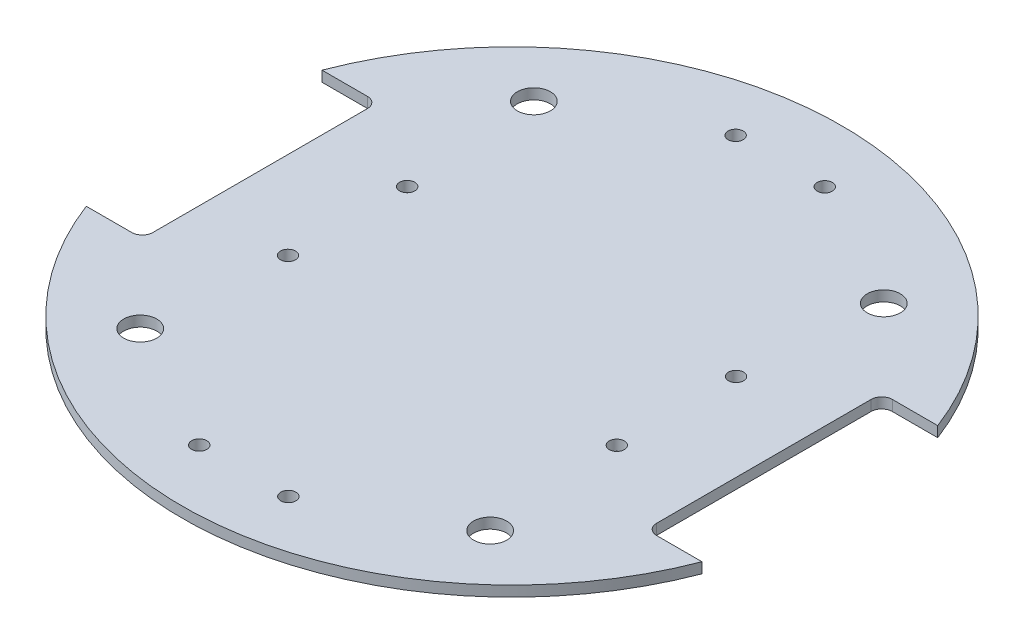
ISO-10303-21;
HEADER;
FILE_DESCRIPTION(('STEP AP214'),'2;1');
FILE_NAME('part.step','',(''),(''),'','','');
FILE_SCHEMA(('AUTOMOTIVE_DESIGN { 1 0 10303 214 1 1 1 1 }'));
ENDSEC;
DATA;
#1=APPLICATION_CONTEXT('core data for automotive mechanical design processes');
#2=APPLICATION_PROTOCOL_DEFINITION('international standard','automotive_design',2000,#1);
#3=PRODUCT_CONTEXT('',#1,'mechanical');
#4=PRODUCT('Part','Part','',(#3));
#5=PRODUCT_RELATED_PRODUCT_CATEGORY('part','',(#4));
#6=PRODUCT_DEFINITION_FORMATION('','',#4);
#7=PRODUCT_DEFINITION_CONTEXT('part definition',#1,'design');
#8=PRODUCT_DEFINITION('design','',#6,#7);
#9=PRODUCT_DEFINITION_SHAPE('','',#8);
#10=(LENGTH_UNIT() NAMED_UNIT(*) SI_UNIT(.MILLI.,.METRE.));
#11=(NAMED_UNIT(*) PLANE_ANGLE_UNIT() SI_UNIT($,.RADIAN.));
#12=(NAMED_UNIT(*) SI_UNIT($,.STERADIAN.) SOLID_ANGLE_UNIT());
#13=UNCERTAINTY_MEASURE_WITH_UNIT(LENGTH_MEASURE(1.E-05),#10,'distance_accuracy_value','');
#14=(GEOMETRIC_REPRESENTATION_CONTEXT(3) GLOBAL_UNCERTAINTY_ASSIGNED_CONTEXT((#13)) GLOBAL_UNIT_ASSIGNED_CONTEXT((#10,
#11,#12)) REPRESENTATION_CONTEXT('',''));
#15=CARTESIAN_POINT('',(0.,0.,0.));
#16=DIRECTION('',(0.,0.,1.));
#17=DIRECTION('',(1.,0.,0.));
#18=AXIS2_PLACEMENT_3D('',#15,#16,#17);
#19=CARTESIAN_POINT('',(0.,1.5875,0.));
#20=DIRECTION('',(0.,1.,0.));
#21=DIRECTION('',(0.,0.,1.));
#22=AXIS2_PLACEMENT_3D('',#19,#20,#21);
#23=PLANE('',#22);
#24=CARTESIAN_POINT('',(24.83,1.5875,9.));
#25=DIRECTION('',(0.,-1.,0.));
#26=DIRECTION('',(0.,0.,-1.));
#27=AXIS2_PLACEMENT_3D('',#24,#25,#26);
#28=CIRCLE('',#27,1.143);
#29=CARTESIAN_POINT('',(24.83,1.5875,7.857));
#30=VERTEX_POINT('',#29);
#31=EDGE_CURVE('E301',#30,#30,#28,.T.);
#32=ORIENTED_EDGE('',*,*,#31,.T.);
#33=EDGE_LOOP('',(#32));
#34=FACE_BOUND('',#33,.T.);
#35=CARTESIAN_POINT('',(24.83,1.5875,-9.));
#36=DIRECTION('',(0.,1.,0.));
#37=DIRECTION('',(0.,0.,1.));
#38=AXIS2_PLACEMENT_3D('',#35,#36,#37);
#39=CIRCLE('',#38,1.143);
#40=CARTESIAN_POINT('',(24.83,1.5875,-7.857));
#41=VERTEX_POINT('',#40);
#42=EDGE_CURVE('E306',#41,#41,#39,.T.);
#43=ORIENTED_EDGE('',*,*,#42,.F.);
#44=EDGE_LOOP('',(#43));
#45=FACE_BOUND('',#44,.T.);
#46=CARTESIAN_POINT('',(-26.42,1.5875,29.72));
#47=DIRECTION('',(0.,-1.,0.));
#48=DIRECTION('',(0.,0.,1.));
#49=AXIS2_PLACEMENT_3D('',#46,#47,#48);
#50=CIRCLE('',#49,2.5);
#51=CARTESIAN_POINT('',(-26.42,1.5875,32.22));
#52=VERTEX_POINT('',#51);
#53=EDGE_CURVE('E199',#52,#52,#50,.T.);
#54=ORIENTED_EDGE('',*,*,#53,.T.);
#55=EDGE_LOOP('',(#54));
#56=FACE_BOUND('',#55,.T.);
#57=CARTESIAN_POINT('',(-6.73,1.5875,-40.5));
#58=DIRECTION('',(0.,-1.,0.));
#59=DIRECTION('',(0.,0.,1.));
#60=AXIS2_PLACEMENT_3D('',#57,#58,#59);
#61=CIRCLE('',#60,1.145);
#62=CARTESIAN_POINT('',(-6.73,1.5875,-39.355));
#63=VERTEX_POINT('',#62);
#64=EDGE_CURVE('E220',#63,#63,#61,.T.);
#65=ORIENTED_EDGE('',*,*,#64,.T.);
#66=EDGE_LOOP('',(#65));
#67=FACE_BOUND('',#66,.T.);
#68=CARTESIAN_POINT('',(6.73,1.5875,-40.5));
#69=DIRECTION('',(0.,1.,0.));
#70=DIRECTION('',(0.,0.,1.));
#71=AXIS2_PLACEMENT_3D('',#68,#69,#70);
#72=CIRCLE('',#71,1.145);
#73=CARTESIAN_POINT('',(6.73,1.5875,-39.355));
#74=VERTEX_POINT('',#73);
#75=EDGE_CURVE('E226',#74,#74,#72,.T.);
#76=ORIENTED_EDGE('',*,*,#75,.F.);
#77=EDGE_LOOP('',(#76));
#78=FACE_BOUND('',#77,.T.);
#79=CARTESIAN_POINT('',(26.42,1.5875,29.72));
#80=DIRECTION('',(0.,1.,0.));
#81=DIRECTION('',(0.,0.,1.));
#82=AXIS2_PLACEMENT_3D('',#79,#80,#81);
#83=CIRCLE('',#82,2.5);
#84=CARTESIAN_POINT('',(26.42,1.5875,32.22));
#85=VERTEX_POINT('',#84);
#86=EDGE_CURVE('E162',#85,#85,#83,.T.);
#87=ORIENTED_EDGE('',*,*,#86,.F.);
#88=EDGE_LOOP('',(#87));
#89=FACE_BOUND('',#88,.T.);
#90=CARTESIAN_POINT('',(26.42,1.5875,-29.72));
#91=DIRECTION('',(0.,1.,0.));
#92=DIRECTION('',(0.,0.,1.));
#93=AXIS2_PLACEMENT_3D('',#90,#91,#92);
#94=CIRCLE('',#93,2.5);
#95=CARTESIAN_POINT('',(26.42,1.5875,-27.22));
#96=VERTEX_POINT('',#95);
#97=EDGE_CURVE('E166',#96,#96,#94,.T.);
#98=ORIENTED_EDGE('',*,*,#97,.F.);
#99=EDGE_LOOP('',(#98));
#100=FACE_BOUND('',#99,.T.);
#101=DIRECTION('',(1.,0.,0.));
#102=VECTOR('',#101,1.);
#103=CARTESIAN_POINT('',(-38.03,1.5875,-17.8));
#104=LINE('',#103,#102);
#105=CARTESIAN_POINT('',(-46.4887986508578,1.5875,-17.8));
#106=VERTEX_POINT('',#105);
#107=CARTESIAN_POINT('',(-39.63,1.5875,-17.8));
#108=VERTEX_POINT('',#107);
#109=EDGE_CURVE('E130',#106,#108,#104,.T.);
#110=ORIENTED_EDGE('',*,*,#109,.T.);
#111=CARTESIAN_POINT('',(-39.63,1.5875,-16.2));
#112=DIRECTION('',(0.,1.,0.));
#113=DIRECTION('',(0.,0.,1.));
#114=AXIS2_PLACEMENT_3D('',#111,#112,#113);
#115=CIRCLE('',#114,1.6);
#116=CARTESIAN_POINT('',(-38.03,1.5875,-16.2));
#117=VERTEX_POINT('',#116);
#118=EDGE_CURVE('E193',#108,#117,#115,.F.);
#119=ORIENTED_EDGE('',*,*,#118,.T.);
#120=DIRECTION('',(0.,0.,1.));
#121=VECTOR('',#120,1.);
#122=CARTESIAN_POINT('',(-38.03,1.5875,0.));
#123=LINE('',#122,#121);
#124=CARTESIAN_POINT('',(-38.03,1.5875,16.2));
#125=VERTEX_POINT('',#124);
#126=EDGE_CURVE('E232',#117,#125,#123,.T.);
#127=ORIENTED_EDGE('',*,*,#126,.T.);
#128=CARTESIAN_POINT('',(-39.63,1.5875,16.2));
#129=DIRECTION('',(0.,1.,0.));
#130=DIRECTION('',(0.,0.,1.));
#131=AXIS2_PLACEMENT_3D('',#128,#129,#130);
#132=CIRCLE('',#131,1.6);
#133=CARTESIAN_POINT('',(-39.63,1.5875,17.8));
#134=VERTEX_POINT('',#133);
#135=EDGE_CURVE('E43',#125,#134,#132,.F.);
#136=ORIENTED_EDGE('',*,*,#135,.T.);
#137=DIRECTION('',(-1.,0.,0.));
#138=VECTOR('',#137,1.);
#139=CARTESIAN_POINT('',(-38.03,1.5875,17.8));
#140=LINE('',#139,#138);
#141=CARTESIAN_POINT('',(-46.4887986508578,1.5875,17.8));
#142=VERTEX_POINT('',#141);
#143=EDGE_CURVE('E236',#134,#142,#140,.T.);
#144=ORIENTED_EDGE('',*,*,#143,.T.);
#145=CARTESIAN_POINT('',(0.,1.5875,0.));
#146=DIRECTION('',(0.,1.,0.));
#147=DIRECTION('',(0.,0.,1.));
#148=AXIS2_PLACEMENT_3D('',#145,#146,#147);
#149=CIRCLE('',#148,49.78);
#150=CARTESIAN_POINT('',(46.4887986508578,1.5875,17.8));
#151=VERTEX_POINT('',#150);
#152=EDGE_CURVE('E152',#142,#151,#149,.T.);
#153=ORIENTED_EDGE('',*,*,#152,.T.);
#154=DIRECTION('',(1.,0.,0.));
#155=VECTOR('',#154,1.);
#156=CARTESIAN_POINT('',(38.03,1.5875,17.8));
#157=LINE('',#156,#155);
#158=CARTESIAN_POINT('',(39.63,1.5875,17.8));
#159=VERTEX_POINT('',#158);
#160=EDGE_CURVE('E243',#159,#151,#157,.T.);
#161=ORIENTED_EDGE('',*,*,#160,.F.);
#162=CARTESIAN_POINT('',(39.63,1.5875,16.2));
#163=DIRECTION('',(0.,1.,0.));
#164=DIRECTION('',(0.,0.,1.));
#165=AXIS2_PLACEMENT_3D('',#162,#163,#164);
#166=CIRCLE('',#165,1.6);
#167=CARTESIAN_POINT('',(38.03,1.5875,16.2));
#168=VERTEX_POINT('',#167);
#169=EDGE_CURVE('E181',#159,#168,#166,.F.);
#170=ORIENTED_EDGE('',*,*,#169,.T.);
#171=DIRECTION('',(0.,0.,1.));
#172=VECTOR('',#171,1.);
#173=CARTESIAN_POINT('',(38.03,1.5875,0.));
#174=LINE('',#173,#172);
#175=CARTESIAN_POINT('',(38.03,1.5875,-16.2));
#176=VERTEX_POINT('',#175);
#177=EDGE_CURVE('E249',#176,#168,#174,.T.);
#178=ORIENTED_EDGE('',*,*,#177,.F.);
#179=CARTESIAN_POINT('',(39.63,1.5875,-16.2));
#180=DIRECTION('',(0.,1.,0.));
#181=DIRECTION('',(0.,0.,1.));
#182=AXIS2_PLACEMENT_3D('',#179,#180,#181);
#183=CIRCLE('',#182,1.6);
#184=CARTESIAN_POINT('',(39.63,1.5875,-17.8));
#185=VERTEX_POINT('',#184);
#186=EDGE_CURVE('E177',#176,#185,#183,.F.);
#187=ORIENTED_EDGE('',*,*,#186,.T.);
#188=DIRECTION('',(-1.,0.,0.));
#189=VECTOR('',#188,1.);
#190=CARTESIAN_POINT('',(38.03,1.5875,-17.8));
#191=LINE('',#190,#189);
#192=CARTESIAN_POINT('',(46.4887986508578,1.5875,-17.8));
#193=VERTEX_POINT('',#192);
#194=EDGE_CURVE('E257',#193,#185,#191,.T.);
#195=ORIENTED_EDGE('',*,*,#194,.F.);
#196=EDGE_CURVE('E155',#193,#106,#149,.T.);
#197=ORIENTED_EDGE('',*,*,#196,.T.);
#198=EDGE_LOOP('',(#110,#119,#127,#136,#144,#153,#161,#170,#178,#187,#195,#197));
#199=FACE_BOUND('',#198,.T.);
#200=CARTESIAN_POINT('',(-6.73,1.5875,40.5));
#201=DIRECTION('',(0.,1.,0.));
#202=DIRECTION('',(0.,0.,-1.));
#203=AXIS2_PLACEMENT_3D('',#200,#201,#202);
#204=CIRCLE('',#203,1.145);
#205=CARTESIAN_POINT('',(-6.73,1.5875,39.355));
#206=VERTEX_POINT('',#205);
#207=EDGE_CURVE('E215',#206,#206,#204,.T.);
#208=ORIENTED_EDGE('',*,*,#207,.F.);
#209=EDGE_LOOP('',(#208));
#210=FACE_BOUND('',#209,.T.);
#211=CARTESIAN_POINT('',(6.73,1.5875,40.5));
#212=DIRECTION('',(0.,-1.,0.));
#213=DIRECTION('',(0.,0.,-1.));
#214=AXIS2_PLACEMENT_3D('',#211,#212,#213);
#215=CIRCLE('',#214,1.145);
#216=CARTESIAN_POINT('',(6.73,1.5875,39.355));
#217=VERTEX_POINT('',#216);
#218=EDGE_CURVE('E198',#217,#217,#215,.T.);
#219=ORIENTED_EDGE('',*,*,#218,.T.);
#220=EDGE_LOOP('',(#219));
#221=FACE_BOUND('',#220,.T.);
#222=CARTESIAN_POINT('',(-26.42,1.5875,-29.72));
#223=DIRECTION('',(0.,-1.,0.));
#224=DIRECTION('',(0.,0.,1.));
#225=AXIS2_PLACEMENT_3D('',#222,#223,#224);
#226=CIRCLE('',#225,2.5);
#227=CARTESIAN_POINT('',(-26.42,1.5875,-27.22));
#228=VERTEX_POINT('',#227);
#229=EDGE_CURVE('E210',#228,#228,#226,.T.);
#230=ORIENTED_EDGE('',*,*,#229,.T.);
#231=EDGE_LOOP('',(#230));
#232=FACE_BOUND('',#231,.T.);
#233=CARTESIAN_POINT('',(-24.83,1.5875,9.));
#234=DIRECTION('',(0.,1.,0.));
#235=DIRECTION('',(0.,0.,-1.));
#236=AXIS2_PLACEMENT_3D('',#233,#234,#235);
#237=CIRCLE('',#236,1.143);
#238=CARTESIAN_POINT('',(-24.83,1.5875,7.857));
#239=VERTEX_POINT('',#238);
#240=EDGE_CURVE('E288',#239,#239,#237,.T.);
#241=ORIENTED_EDGE('',*,*,#240,.F.);
#242=EDGE_LOOP('',(#241));
#243=FACE_BOUND('',#242,.T.);
#244=CARTESIAN_POINT('',(-24.83,1.5875,-9.));
#245=DIRECTION('',(0.,-1.,0.));
#246=DIRECTION('',(0.,0.,1.));
#247=AXIS2_PLACEMENT_3D('',#244,#245,#246);
#248=CIRCLE('',#247,1.143);
#249=CARTESIAN_POINT('',(-24.83,1.5875,-7.857));
#250=VERTEX_POINT('',#249);
#251=EDGE_CURVE('E291',#250,#250,#248,.T.);
#252=ORIENTED_EDGE('',*,*,#251,.T.);
#253=EDGE_LOOP('',(#252));
#254=FACE_BOUND('',#253,.T.);
#255=ADVANCED_FACE('F34',(#34,#45,#56,#67,#78,#89,#100,#199,#210,#221,#232,#243,#254),#23,.T.);
#256=CARTESIAN_POINT('',(0.,0.,0.));
#257=DIRECTION('',(0.,1.,0.));
#258=DIRECTION('',(0.,0.,1.));
#259=AXIS2_PLACEMENT_3D('',#256,#257,#258);
#260=PLANE('',#259);
#261=CARTESIAN_POINT('',(24.83,0.,9.));
#262=DIRECTION('',(0.,-1.,0.));
#263=DIRECTION('',(0.,0.,-1.));
#264=AXIS2_PLACEMENT_3D('',#261,#262,#263);
#265=CIRCLE('',#264,1.143);
#266=CARTESIAN_POINT('',(24.83,0.,7.857));
#267=VERTEX_POINT('',#266);
#268=EDGE_CURVE('E303',#267,#267,#265,.T.);
#269=ORIENTED_EDGE('',*,*,#268,.F.);
#270=EDGE_LOOP('',(#269));
#271=FACE_BOUND('',#270,.T.);
#272=CARTESIAN_POINT('',(24.83,0.,-9.));
#273=DIRECTION('',(0.,1.,0.));
#274=DIRECTION('',(0.,0.,1.));
#275=AXIS2_PLACEMENT_3D('',#272,#273,#274);
#276=CIRCLE('',#275,1.143);
#277=CARTESIAN_POINT('',(24.83,0.,-7.857));
#278=VERTEX_POINT('',#277);
#279=EDGE_CURVE('E309',#278,#278,#276,.T.);
#280=ORIENTED_EDGE('',*,*,#279,.T.);
#281=EDGE_LOOP('',(#280));
#282=FACE_BOUND('',#281,.T.);
#283=CARTESIAN_POINT('',(-26.42,0.,29.72));
#284=DIRECTION('',(0.,1.,0.));
#285=DIRECTION('',(0.,0.,1.));
#286=AXIS2_PLACEMENT_3D('',#283,#284,#285);
#287=CIRCLE('',#286,2.5);
#288=CARTESIAN_POINT('',(-26.42,0.,32.22));
#289=VERTEX_POINT('',#288);
#290=EDGE_CURVE('E196',#289,#289,#287,.F.);
#291=ORIENTED_EDGE('',*,*,#290,.F.);
#292=EDGE_LOOP('',(#291));
#293=FACE_BOUND('',#292,.T.);
#294=CARTESIAN_POINT('',(-6.73,0.,-40.5));
#295=DIRECTION('',(0.,-1.,0.));
#296=DIRECTION('',(0.,0.,1.));
#297=AXIS2_PLACEMENT_3D('',#294,#295,#296);
#298=CIRCLE('',#297,1.145);
#299=CARTESIAN_POINT('',(-6.73,0.,-39.355));
#300=VERTEX_POINT('',#299);
#301=EDGE_CURVE('E223',#300,#300,#298,.T.);
#302=ORIENTED_EDGE('',*,*,#301,.F.);
#303=EDGE_LOOP('',(#302));
#304=FACE_BOUND('',#303,.T.);
#305=CARTESIAN_POINT('',(6.73,0.,-40.5));
#306=DIRECTION('',(0.,1.,0.));
#307=DIRECTION('',(0.,0.,1.));
#308=AXIS2_PLACEMENT_3D('',#305,#306,#307);
#309=CIRCLE('',#308,1.145);
#310=CARTESIAN_POINT('',(6.73,0.,-39.355));
#311=VERTEX_POINT('',#310);
#312=EDGE_CURVE('E229',#311,#311,#309,.T.);
#313=ORIENTED_EDGE('',*,*,#312,.T.);
#314=EDGE_LOOP('',(#313));
#315=FACE_BOUND('',#314,.T.);
#316=CARTESIAN_POINT('',(26.42,0.,29.72));
#317=DIRECTION('',(0.,1.,0.));
#318=DIRECTION('',(0.,0.,1.));
#319=AXIS2_PLACEMENT_3D('',#316,#317,#318);
#320=CIRCLE('',#319,2.5);
#321=CARTESIAN_POINT('',(26.42,0.,32.22));
#322=VERTEX_POINT('',#321);
#323=EDGE_CURVE('E157',#322,#322,#320,.T.);
#324=ORIENTED_EDGE('',*,*,#323,.T.);
#325=EDGE_LOOP('',(#324));
#326=FACE_BOUND('',#325,.T.);
#327=CARTESIAN_POINT('',(26.42,0.,-29.72));
#328=DIRECTION('',(0.,1.,0.));
#329=DIRECTION('',(0.,0.,1.));
#330=AXIS2_PLACEMENT_3D('',#327,#328,#329);
#331=CIRCLE('',#330,2.5);
#332=CARTESIAN_POINT('',(26.42,0.,-27.22));
#333=VERTEX_POINT('',#332);
#334=EDGE_CURVE('E163',#333,#333,#331,.T.);
#335=ORIENTED_EDGE('',*,*,#334,.T.);
#336=EDGE_LOOP('',(#335));
#337=FACE_BOUND('',#336,.T.);
#338=DIRECTION('',(-1.,0.,0.));
#339=VECTOR('',#338,1.);
#340=CARTESIAN_POINT('',(-38.03,0.,17.8));
#341=LINE('',#340,#339);
#342=CARTESIAN_POINT('',(-39.63,0.,17.8));
#343=VERTEX_POINT('',#342);
#344=CARTESIAN_POINT('',(-46.4887986508578,0.,17.8));
#345=VERTEX_POINT('',#344);
#346=EDGE_CURVE('E136',#343,#345,#341,.T.);
#347=ORIENTED_EDGE('',*,*,#346,.F.);
#348=CARTESIAN_POINT('',(-39.63,0.,16.2));
#349=DIRECTION('',(0.,1.,0.));
#350=DIRECTION('',(0.,0.,1.));
#351=AXIS2_PLACEMENT_3D('',#348,#349,#350);
#352=CIRCLE('',#351,1.6);
#353=CARTESIAN_POINT('',(-38.03,0.,16.2));
#354=VERTEX_POINT('',#353);
#355=EDGE_CURVE('E11',#343,#354,#352,.T.);
#356=ORIENTED_EDGE('',*,*,#355,.T.);
#357=DIRECTION('',(0.,0.,1.));
#358=VECTOR('',#357,1.);
#359=CARTESIAN_POINT('',(-38.03,0.,0.));
#360=LINE('',#359,#358);
#361=CARTESIAN_POINT('',(-38.03,0.,-16.2));
#362=VERTEX_POINT('',#361);
#363=EDGE_CURVE('E147',#362,#354,#360,.T.);
#364=ORIENTED_EDGE('',*,*,#363,.F.);
#365=CARTESIAN_POINT('',(-39.63,0.,-16.2));
#366=DIRECTION('',(0.,1.,0.));
#367=DIRECTION('',(0.,0.,1.));
#368=AXIS2_PLACEMENT_3D('',#365,#366,#367);
#369=CIRCLE('',#368,1.6);
#370=CARTESIAN_POINT('',(-39.63,0.,-17.8));
#371=VERTEX_POINT('',#370);
#372=EDGE_CURVE('E146',#362,#371,#369,.T.);
#373=ORIENTED_EDGE('',*,*,#372,.T.);
#374=DIRECTION('',(1.,0.,0.));
#375=VECTOR('',#374,1.);
#376=CARTESIAN_POINT('',(-38.03,0.,-17.8));
#377=LINE('',#376,#375);
#378=CARTESIAN_POINT('',(-46.4887986508578,0.,-17.8));
#379=VERTEX_POINT('',#378);
#380=EDGE_CURVE('E127',#379,#371,#377,.T.);
#381=ORIENTED_EDGE('',*,*,#380,.F.);
#382=CARTESIAN_POINT('',(0.,0.,0.));
#383=DIRECTION('',(0.,1.,0.));
#384=DIRECTION('',(0.,0.,1.));
#385=AXIS2_PLACEMENT_3D('',#382,#383,#384);
#386=CIRCLE('',#385,49.78);
#387=CARTESIAN_POINT('',(46.4887986508578,0.,-17.8));
#388=VERTEX_POINT('',#387);
#389=EDGE_CURVE('E143',#388,#379,#386,.T.);
#390=ORIENTED_EDGE('',*,*,#389,.F.);
#391=DIRECTION('',(-1.,0.,0.));
#392=VECTOR('',#391,1.);
#393=CARTESIAN_POINT('',(38.03,0.,-17.8));
#394=LINE('',#393,#392);
#395=CARTESIAN_POINT('',(39.63,0.,-17.8));
#396=VERTEX_POINT('',#395);
#397=EDGE_CURVE('E252',#388,#396,#394,.T.);
#398=ORIENTED_EDGE('',*,*,#397,.T.);
#399=CARTESIAN_POINT('',(39.63,0.,-16.2));
#400=DIRECTION('',(0.,1.,0.));
#401=DIRECTION('',(0.,0.,1.));
#402=AXIS2_PLACEMENT_3D('',#399,#400,#401);
#403=CIRCLE('',#402,1.6);
#404=CARTESIAN_POINT('',(38.03,0.,-16.2));
#405=VERTEX_POINT('',#404);
#406=EDGE_CURVE('E179',#396,#405,#403,.T.);
#407=ORIENTED_EDGE('',*,*,#406,.T.);
#408=DIRECTION('',(0.,0.,1.));
#409=VECTOR('',#408,1.);
#410=CARTESIAN_POINT('',(38.03,0.,0.));
#411=LINE('',#410,#409);
#412=CARTESIAN_POINT('',(38.03,0.,16.2));
#413=VERTEX_POINT('',#412);
#414=EDGE_CURVE('E245',#405,#413,#411,.T.);
#415=ORIENTED_EDGE('',*,*,#414,.T.);
#416=CARTESIAN_POINT('',(39.63,0.,16.2));
#417=DIRECTION('',(0.,1.,0.));
#418=DIRECTION('',(0.,0.,1.));
#419=AXIS2_PLACEMENT_3D('',#416,#417,#418);
#420=CIRCLE('',#419,1.6);
#421=CARTESIAN_POINT('',(39.63,0.,17.8));
#422=VERTEX_POINT('',#421);
#423=EDGE_CURVE('E183',#413,#422,#420,.T.);
#424=ORIENTED_EDGE('',*,*,#423,.T.);
#425=DIRECTION('',(1.,0.,0.));
#426=VECTOR('',#425,1.);
#427=CARTESIAN_POINT('',(38.03,0.,17.8));
#428=LINE('',#427,#426);
#429=CARTESIAN_POINT('',(46.4887986508578,0.,17.8));
#430=VERTEX_POINT('',#429);
#431=EDGE_CURVE('E248',#422,#430,#428,.T.);
#432=ORIENTED_EDGE('',*,*,#431,.T.);
#433=EDGE_CURVE('E153',#345,#430,#386,.T.);
#434=ORIENTED_EDGE('',*,*,#433,.F.);
#435=EDGE_LOOP('',(#347,#356,#364,#373,#381,#390,#398,#407,#415,#424,#432,#434));
#436=FACE_BOUND('',#435,.T.);
#437=CARTESIAN_POINT('',(-6.73,0.,40.5));
#438=DIRECTION('',(0.,1.,0.));
#439=DIRECTION('',(0.,0.,-1.));
#440=AXIS2_PLACEMENT_3D('',#437,#438,#439);
#441=CIRCLE('',#440,1.145);
#442=CARTESIAN_POINT('',(-6.73,0.,39.355));
#443=VERTEX_POINT('',#442);
#444=EDGE_CURVE('E217',#443,#443,#441,.T.);
#445=ORIENTED_EDGE('',*,*,#444,.T.);
#446=EDGE_LOOP('',(#445));
#447=FACE_BOUND('',#446,.T.);
#448=CARTESIAN_POINT('',(6.73,0.,40.5));
#449=DIRECTION('',(0.,-1.,0.));
#450=DIRECTION('',(0.,0.,-1.));
#451=AXIS2_PLACEMENT_3D('',#448,#449,#450);
#452=CIRCLE('',#451,1.145);
#453=CARTESIAN_POINT('',(6.73,0.,39.355));
#454=VERTEX_POINT('',#453);
#455=EDGE_CURVE('E203',#454,#454,#452,.T.);
#456=ORIENTED_EDGE('',*,*,#455,.F.);
#457=EDGE_LOOP('',(#456));
#458=FACE_BOUND('',#457,.T.);
#459=CARTESIAN_POINT('',(-26.42,0.,-29.72));
#460=DIRECTION('',(0.,1.,0.));
#461=DIRECTION('',(0.,0.,1.));
#462=AXIS2_PLACEMENT_3D('',#459,#460,#461);
#463=CIRCLE('',#462,2.5);
#464=CARTESIAN_POINT('',(-26.42,0.,-27.22));
#465=VERTEX_POINT('',#464);
#466=EDGE_CURVE('E38',#465,#465,#463,.F.);
#467=ORIENTED_EDGE('',*,*,#466,.F.);
#468=EDGE_LOOP('',(#467));
#469=FACE_BOUND('',#468,.T.);
#470=CARTESIAN_POINT('',(-24.83,0.,9.));
#471=DIRECTION('',(0.,1.,0.));
#472=DIRECTION('',(0.,0.,-1.));
#473=AXIS2_PLACEMENT_3D('',#470,#471,#472);
#474=CIRCLE('',#473,1.143);
#475=CARTESIAN_POINT('',(-24.83,0.,7.857));
#476=VERTEX_POINT('',#475);
#477=EDGE_CURVE('E298',#476,#476,#474,.T.);
#478=ORIENTED_EDGE('',*,*,#477,.T.);
#479=EDGE_LOOP('',(#478));
#480=FACE_BOUND('',#479,.T.);
#481=CARTESIAN_POINT('',(-24.83,0.,-9.));
#482=DIRECTION('',(0.,-1.,0.));
#483=DIRECTION('',(0.,0.,1.));
#484=AXIS2_PLACEMENT_3D('',#481,#482,#483);
#485=CIRCLE('',#484,1.143);
#486=CARTESIAN_POINT('',(-24.83,0.,-7.857));
#487=VERTEX_POINT('',#486);
#488=EDGE_CURVE('E293',#487,#487,#485,.T.);
#489=ORIENTED_EDGE('',*,*,#488,.F.);
#490=EDGE_LOOP('',(#489));
#491=FACE_BOUND('',#490,.T.);
#492=ADVANCED_FACE('F140',(#271,#282,#293,#304,#315,#326,#337,#436,#447,#458,#469,#480,#491),
#260,.F.);
#493=CARTESIAN_POINT('',(0.,1.5875,0.));
#494=DIRECTION('',(0.,-1.,0.));
#495=DIRECTION('',(0.,0.,-1.));
#496=AXIS2_PLACEMENT_3D('',#493,#494,#495);
#497=CYLINDRICAL_SURFACE('',#496,49.78);
#498=DIRECTION('',(0.,1.,0.));
#499=VECTOR('',#498,1.);
#500=CARTESIAN_POINT('',(-46.4887986508578,0.,17.8));
#501=LINE('',#500,#499);
#502=EDGE_CURVE('E135',#345,#142,#501,.T.);
#503=ORIENTED_EDGE('',*,*,#502,.F.);
#504=ORIENTED_EDGE('',*,*,#433,.T.);
#505=DIRECTION('',(0.,1.,0.));
#506=VECTOR('',#505,1.);
#507=CARTESIAN_POINT('',(46.4887986508578,0.,17.8));
#508=LINE('',#507,#506);
#509=EDGE_CURVE('E254',#430,#151,#508,.T.);
#510=ORIENTED_EDGE('',*,*,#509,.T.);
#511=ORIENTED_EDGE('',*,*,#152,.F.);
#512=EDGE_LOOP('',(#503,#504,#510,#511));
#513=FACE_BOUND('',#512,.T.);
#514=ADVANCED_FACE('F369',(#513),#497,.T.);
#515=DIRECTION('',(0.,1.,0.));
#516=VECTOR('',#515,1.);
#517=CARTESIAN_POINT('',(-46.4887986508578,0.,-17.8));
#518=LINE('',#517,#516);
#519=EDGE_CURVE('E123',#379,#106,#518,.T.);
#520=ORIENTED_EDGE('',*,*,#519,.T.);
#521=ORIENTED_EDGE('',*,*,#196,.F.);
#522=DIRECTION('',(0.,1.,0.));
#523=VECTOR('',#522,1.);
#524=CARTESIAN_POINT('',(46.4887986508578,0.,-17.8));
#525=LINE('',#524,#523);
#526=EDGE_CURVE('E151',#388,#193,#525,.T.);
#527=ORIENTED_EDGE('',*,*,#526,.F.);
#528=ORIENTED_EDGE('',*,*,#389,.T.);
#529=EDGE_LOOP('',(#520,#521,#527,#528));
#530=FACE_BOUND('',#529,.T.);
#531=ADVANCED_FACE('F150',(#530),#497,.T.);
#532=CARTESIAN_POINT('',(26.42,-8.4125,29.72));
#533=DIRECTION('',(0.,1.,0.));
#534=DIRECTION('',(0.,0.,1.));
#535=AXIS2_PLACEMENT_3D('',#532,#533,#534);
#536=CYLINDRICAL_SURFACE('',#535,2.5);
#537=ORIENTED_EDGE('',*,*,#86,.T.);
#538=EDGE_LOOP('',(#537));
#539=FACE_BOUND('',#538,.T.);
#540=ORIENTED_EDGE('',*,*,#323,.F.);
#541=EDGE_LOOP('',(#540));
#542=FACE_BOUND('',#541,.T.);
#543=ADVANCED_FACE('F269',(#539,#542),#536,.F.);
#544=CARTESIAN_POINT('',(26.42,-8.4125,-29.72));
#545=DIRECTION('',(0.,1.,0.));
#546=DIRECTION('',(0.,0.,1.));
#547=AXIS2_PLACEMENT_3D('',#544,#545,#546);
#548=CYLINDRICAL_SURFACE('',#547,2.5);
#549=ORIENTED_EDGE('',*,*,#97,.T.);
#550=EDGE_LOOP('',(#549));
#551=FACE_BOUND('',#550,.T.);
#552=ORIENTED_EDGE('',*,*,#334,.F.);
#553=EDGE_LOOP('',(#552));
#554=FACE_BOUND('',#553,.T.);
#555=ADVANCED_FACE('F352',(#551,#554),#548,.F.);
#556=CARTESIAN_POINT('',(38.03,0.,0.));
#557=DIRECTION('',(-1.,0.,0.));
#558=DIRECTION('',(0.,0.,1.));
#559=AXIS2_PLACEMENT_3D('',#556,#557,#558);
#560=PLANE('',#559);
#561=ORIENTED_EDGE('',*,*,#414,.F.);
#562=DIRECTION('',(0.,1.,0.));
#563=VECTOR('',#562,1.);
#564=CARTESIAN_POINT('',(38.03,1.5875,-16.2));
#565=LINE('',#564,#563);
#566=EDGE_CURVE('E169',#405,#176,#565,.T.);
#567=ORIENTED_EDGE('',*,*,#566,.T.);
#568=ORIENTED_EDGE('',*,*,#177,.T.);
#569=DIRECTION('',(0.,1.,0.));
#570=VECTOR('',#569,1.);
#571=CARTESIAN_POINT('',(38.03,0.,16.2));
#572=LINE('',#571,#570);
#573=EDGE_CURVE('E167',#168,#413,#572,.F.);
#574=ORIENTED_EDGE('',*,*,#573,.T.);
#575=EDGE_LOOP('',(#561,#567,#568,#574));
#576=FACE_BOUND('',#575,.T.);
#577=ADVANCED_FACE('F348',(#576),#560,.F.);
#578=CARTESIAN_POINT('',(38.03,0.,-17.8));
#579=DIRECTION('',(0.,0.,-1.));
#580=DIRECTION('',(-1.,0.,0.));
#581=AXIS2_PLACEMENT_3D('',#578,#579,#580);
#582=PLANE('',#581);
#583=ORIENTED_EDGE('',*,*,#194,.T.);
#584=DIRECTION('',(0.,1.,0.));
#585=VECTOR('',#584,1.);
#586=CARTESIAN_POINT('',(39.63,0.,-17.8));
#587=LINE('',#586,#585);
#588=EDGE_CURVE('E172',#185,#396,#587,.F.);
#589=ORIENTED_EDGE('',*,*,#588,.T.);
#590=ORIENTED_EDGE('',*,*,#397,.F.);
#591=ORIENTED_EDGE('',*,*,#526,.T.);
#592=EDGE_LOOP('',(#583,#589,#590,#591));
#593=FACE_BOUND('',#592,.T.);
#594=ADVANCED_FACE('F351',(#593),#582,.F.);
#595=CARTESIAN_POINT('',(38.03,0.,17.8));
#596=DIRECTION('',(0.,0.,1.));
#597=DIRECTION('',(1.,0.,0.));
#598=AXIS2_PLACEMENT_3D('',#595,#596,#597);
#599=PLANE('',#598);
#600=ORIENTED_EDGE('',*,*,#431,.F.);
#601=DIRECTION('',(0.,1.,0.));
#602=VECTOR('',#601,1.);
#603=CARTESIAN_POINT('',(39.63,1.5875,17.8));
#604=LINE('',#603,#602);
#605=EDGE_CURVE('E174',#422,#159,#604,.T.);
#606=ORIENTED_EDGE('',*,*,#605,.T.);
#607=ORIENTED_EDGE('',*,*,#160,.T.);
#608=ORIENTED_EDGE('',*,*,#509,.F.);
#609=EDGE_LOOP('',(#600,#606,#607,#608));
#610=FACE_BOUND('',#609,.T.);
#611=ADVANCED_FACE('F356',(#610),#599,.F.);
#612=CARTESIAN_POINT('',(39.63,0.,-16.2));
#613=DIRECTION('',(0.,-1.,0.));
#614=DIRECTION('',(0.,0.,-1.));
#615=AXIS2_PLACEMENT_3D('',#612,#613,#614);
#616=CYLINDRICAL_SURFACE('',#615,1.6);
#617=ORIENTED_EDGE('',*,*,#406,.F.);
#618=ORIENTED_EDGE('',*,*,#588,.F.);
#619=ORIENTED_EDGE('',*,*,#186,.F.);
#620=ORIENTED_EDGE('',*,*,#566,.F.);
#621=EDGE_LOOP('',(#617,#618,#619,#620));
#622=FACE_BOUND('',#621,.T.);
#623=ADVANCED_FACE('F360',(#622),#616,.F.);
#624=CARTESIAN_POINT('',(39.63,0.,16.2));
#625=DIRECTION('',(0.,-1.,0.));
#626=DIRECTION('',(0.,0.,-1.));
#627=AXIS2_PLACEMENT_3D('',#624,#625,#626);
#628=CYLINDRICAL_SURFACE('',#627,1.6);
#629=ORIENTED_EDGE('',*,*,#423,.F.);
#630=ORIENTED_EDGE('',*,*,#573,.F.);
#631=ORIENTED_EDGE('',*,*,#169,.F.);
#632=ORIENTED_EDGE('',*,*,#605,.F.);
#633=EDGE_LOOP('',(#629,#630,#631,#632));
#634=FACE_BOUND('',#633,.T.);
#635=ADVANCED_FACE('F341',(#634),#628,.F.);
#636=CARTESIAN_POINT('',(-38.03,0.,17.8));
#637=DIRECTION('',(0.,0.,-1.));
#638=DIRECTION('',(-1.,0.,0.));
#639=AXIS2_PLACEMENT_3D('',#636,#637,#638);
#640=PLANE('',#639);
#641=ORIENTED_EDGE('',*,*,#143,.F.);
#642=DIRECTION('',(0.,1.,0.));
#643=VECTOR('',#642,1.);
#644=CARTESIAN_POINT('',(-39.63,0.,17.8));
#645=LINE('',#644,#643);
#646=EDGE_CURVE('E51',#134,#343,#645,.F.);
#647=ORIENTED_EDGE('',*,*,#646,.T.);
#648=ORIENTED_EDGE('',*,*,#346,.T.);
#649=ORIENTED_EDGE('',*,*,#502,.T.);
#650=EDGE_LOOP('',(#641,#647,#648,#649));
#651=FACE_BOUND('',#650,.T.);
#652=ADVANCED_FACE('F338',(#651),#640,.T.);
#653=CARTESIAN_POINT('',(-38.03,0.,-17.8));
#654=DIRECTION('',(0.,0.,1.));
#655=DIRECTION('',(1.,0.,0.));
#656=AXIS2_PLACEMENT_3D('',#653,#654,#655);
#657=PLANE('',#656);
#658=ORIENTED_EDGE('',*,*,#380,.T.);
#659=DIRECTION('',(0.,1.,0.));
#660=VECTOR('',#659,1.);
#661=CARTESIAN_POINT('',(-39.63,1.5875,-17.8));
#662=LINE('',#661,#660);
#663=EDGE_CURVE('E185',#371,#108,#662,.T.);
#664=ORIENTED_EDGE('',*,*,#663,.T.);
#665=ORIENTED_EDGE('',*,*,#109,.F.);
#666=ORIENTED_EDGE('',*,*,#519,.F.);
#667=EDGE_LOOP('',(#658,#664,#665,#666));
#668=FACE_BOUND('',#667,.T.);
#669=ADVANCED_FACE('F125',(#668),#657,.T.);
#670=CARTESIAN_POINT('',(-38.03,0.,0.));
#671=DIRECTION('',(-1.,0.,0.));
#672=DIRECTION('',(0.,0.,1.));
#673=AXIS2_PLACEMENT_3D('',#670,#671,#672);
#674=PLANE('',#673);
#675=ORIENTED_EDGE('',*,*,#126,.F.);
#676=DIRECTION('',(0.,1.,0.));
#677=VECTOR('',#676,1.);
#678=CARTESIAN_POINT('',(-38.03,0.,-16.2));
#679=LINE('',#678,#677);
#680=EDGE_CURVE('E190',#117,#362,#679,.F.);
#681=ORIENTED_EDGE('',*,*,#680,.T.);
#682=ORIENTED_EDGE('',*,*,#363,.T.);
#683=DIRECTION('',(0.,1.,0.));
#684=VECTOR('',#683,1.);
#685=CARTESIAN_POINT('',(-38.03,1.5875,16.2));
#686=LINE('',#685,#684);
#687=EDGE_CURVE('E187',#354,#125,#686,.T.);
#688=ORIENTED_EDGE('',*,*,#687,.T.);
#689=EDGE_LOOP('',(#675,#681,#682,#688));
#690=FACE_BOUND('',#689,.T.);
#691=ADVANCED_FACE('F344',(#690),#674,.T.);
#692=CARTESIAN_POINT('',(-39.63,0.,-16.2));
#693=DIRECTION('',(0.,-1.,0.));
#694=DIRECTION('',(0.,0.,-1.));
#695=AXIS2_PLACEMENT_3D('',#692,#693,#694);
#696=CYLINDRICAL_SURFACE('',#695,1.6);
#697=ORIENTED_EDGE('',*,*,#372,.F.);
#698=ORIENTED_EDGE('',*,*,#680,.F.);
#699=ORIENTED_EDGE('',*,*,#118,.F.);
#700=ORIENTED_EDGE('',*,*,#663,.F.);
#701=EDGE_LOOP('',(#697,#698,#699,#700));
#702=FACE_BOUND('',#701,.T.);
#703=ADVANCED_FACE('F333',(#702),#696,.F.);
#704=CARTESIAN_POINT('',(-39.63,0.,16.2));
#705=DIRECTION('',(0.,-1.,0.));
#706=DIRECTION('',(0.,0.,-1.));
#707=AXIS2_PLACEMENT_3D('',#704,#705,#706);
#708=CYLINDRICAL_SURFACE('',#707,1.6);
#709=ORIENTED_EDGE('',*,*,#355,.F.);
#710=ORIENTED_EDGE('',*,*,#646,.F.);
#711=ORIENTED_EDGE('',*,*,#135,.F.);
#712=ORIENTED_EDGE('',*,*,#687,.F.);
#713=EDGE_LOOP('',(#709,#710,#711,#712));
#714=FACE_BOUND('',#713,.T.);
#715=ADVANCED_FACE('F36',(#714),#708,.F.);
#716=CARTESIAN_POINT('',(6.73,0.,-40.5));
#717=DIRECTION('',(0.,1.,0.));
#718=DIRECTION('',(0.,0.,1.));
#719=AXIS2_PLACEMENT_3D('',#716,#717,#718);
#720=CYLINDRICAL_SURFACE('',#719,1.145);
#721=ORIENTED_EDGE('',*,*,#312,.F.);
#722=EDGE_LOOP('',(#721));
#723=FACE_BOUND('',#722,.T.);
#724=ORIENTED_EDGE('',*,*,#75,.T.);
#725=EDGE_LOOP('',(#724));
#726=FACE_BOUND('',#725,.T.);
#727=ADVANCED_FACE('F321',(#723,#726),#720,.F.);
#728=CARTESIAN_POINT('',(-6.73,0.,-40.5));
#729=DIRECTION('',(0.,1.,0.));
#730=DIRECTION('',(0.,0.,1.));
#731=AXIS2_PLACEMENT_3D('',#728,#729,#730);
#732=CYLINDRICAL_SURFACE('',#731,1.145);
#733=ORIENTED_EDGE('',*,*,#301,.T.);
#734=EDGE_LOOP('',(#733));
#735=FACE_BOUND('',#734,.T.);
#736=ORIENTED_EDGE('',*,*,#64,.F.);
#737=EDGE_LOOP('',(#736));
#738=FACE_BOUND('',#737,.T.);
#739=ADVANCED_FACE('F323',(#735,#738),#732,.F.);
#740=CARTESIAN_POINT('',(-6.73,0.,40.5));
#741=DIRECTION('',(0.,1.,0.));
#742=DIRECTION('',(0.,0.,1.));
#743=AXIS2_PLACEMENT_3D('',#740,#741,#742);
#744=CYLINDRICAL_SURFACE('',#743,1.145);
#745=ORIENTED_EDGE('',*,*,#444,.F.);
#746=EDGE_LOOP('',(#745));
#747=FACE_BOUND('',#746,.T.);
#748=ORIENTED_EDGE('',*,*,#207,.T.);
#749=EDGE_LOOP('',(#748));
#750=FACE_BOUND('',#749,.T.);
#751=ADVANCED_FACE('F330',(#747,#750),#744,.F.);
#752=CARTESIAN_POINT('',(6.73,0.,40.5));
#753=DIRECTION('',(0.,1.,0.));
#754=DIRECTION('',(0.,0.,1.));
#755=AXIS2_PLACEMENT_3D('',#752,#753,#754);
#756=CYLINDRICAL_SURFACE('',#755,1.145);
#757=ORIENTED_EDGE('',*,*,#455,.T.);
#758=EDGE_LOOP('',(#757));
#759=FACE_BOUND('',#758,.T.);
#760=ORIENTED_EDGE('',*,*,#218,.F.);
#761=EDGE_LOOP('',(#760));
#762=FACE_BOUND('',#761,.T.);
#763=ADVANCED_FACE('F427',(#759,#762),#756,.F.);
#764=CARTESIAN_POINT('',(-26.42,-8.4125,29.72));
#765=DIRECTION('',(0.,1.,0.));
#766=DIRECTION('',(0.,0.,1.));
#767=AXIS2_PLACEMENT_3D('',#764,#765,#766);
#768=CYLINDRICAL_SURFACE('',#767,2.5);
#769=ORIENTED_EDGE('',*,*,#53,.F.);
#770=EDGE_LOOP('',(#769));
#771=FACE_BOUND('',#770,.T.);
#772=ORIENTED_EDGE('',*,*,#290,.T.);
#773=EDGE_LOOP('',(#772));
#774=FACE_BOUND('',#773,.T.);
#775=ADVANCED_FACE('F436',(#771,#774),#768,.F.);
#776=CARTESIAN_POINT('',(-26.42,-8.4125,-29.72));
#777=DIRECTION('',(0.,1.,0.));
#778=DIRECTION('',(0.,0.,1.));
#779=AXIS2_PLACEMENT_3D('',#776,#777,#778);
#780=CYLINDRICAL_SURFACE('',#779,2.5);
#781=ORIENTED_EDGE('',*,*,#229,.F.);
#782=EDGE_LOOP('',(#781));
#783=FACE_BOUND('',#782,.T.);
#784=ORIENTED_EDGE('',*,*,#466,.T.);
#785=EDGE_LOOP('',(#784));
#786=FACE_BOUND('',#785,.T.);
#787=ADVANCED_FACE('F446',(#783,#786),#780,.F.);
#788=CARTESIAN_POINT('',(24.83,0.,-9.));
#789=DIRECTION('',(0.,1.,0.));
#790=DIRECTION('',(0.,0.,1.));
#791=AXIS2_PLACEMENT_3D('',#788,#789,#790);
#792=CYLINDRICAL_SURFACE('',#791,1.143);
#793=ORIENTED_EDGE('',*,*,#279,.F.);
#794=EDGE_LOOP('',(#793));
#795=FACE_BOUND('',#794,.T.);
#796=ORIENTED_EDGE('',*,*,#42,.T.);
#797=EDGE_LOOP('',(#796));
#798=FACE_BOUND('',#797,.T.);
#799=ADVANCED_FACE('F314',(#795,#798),#792,.F.);
#800=CARTESIAN_POINT('',(24.83,0.,9.));
#801=DIRECTION('',(0.,1.,0.));
#802=DIRECTION('',(0.,0.,1.));
#803=AXIS2_PLACEMENT_3D('',#800,#801,#802);
#804=CYLINDRICAL_SURFACE('',#803,1.143);
#805=ORIENTED_EDGE('',*,*,#268,.T.);
#806=EDGE_LOOP('',(#805));
#807=FACE_BOUND('',#806,.T.);
#808=ORIENTED_EDGE('',*,*,#31,.F.);
#809=EDGE_LOOP('',(#808));
#810=FACE_BOUND('',#809,.T.);
#811=ADVANCED_FACE('F465',(#807,#810),#804,.F.);
#812=CARTESIAN_POINT('',(-24.83,0.,9.));
#813=DIRECTION('',(0.,1.,0.));
#814=DIRECTION('',(0.,0.,1.));
#815=AXIS2_PLACEMENT_3D('',#812,#813,#814);
#816=CYLINDRICAL_SURFACE('',#815,1.143);
#817=ORIENTED_EDGE('',*,*,#477,.F.);
#818=EDGE_LOOP('',(#817));
#819=FACE_BOUND('',#818,.T.);
#820=ORIENTED_EDGE('',*,*,#240,.T.);
#821=EDGE_LOOP('',(#820));
#822=FACE_BOUND('',#821,.T.);
#823=ADVANCED_FACE('F475',(#819,#822),#816,.F.);
#824=CARTESIAN_POINT('',(-24.83,0.,-9.));
#825=DIRECTION('',(0.,1.,0.));
#826=DIRECTION('',(0.,0.,1.));
#827=AXIS2_PLACEMENT_3D('',#824,#825,#826);
#828=CYLINDRICAL_SURFACE('',#827,1.143);
#829=ORIENTED_EDGE('',*,*,#488,.T.);
#830=EDGE_LOOP('',(#829));
#831=FACE_BOUND('',#830,.T.);
#832=ORIENTED_EDGE('',*,*,#251,.F.);
#833=EDGE_LOOP('',(#832));
#834=FACE_BOUND('',#833,.T.);
#835=ADVANCED_FACE('F497',(#831,#834),#828,.F.);
#836=CLOSED_SHELL('',(#255,#492,#514,#531,#543,#555,#577,#594,#611,#623,#635,#652,#669,#691,
#703,#715,#727,#739,#751,#763,#775,#787,#799,#811,#823,#835));
#837=MANIFOLD_SOLID_BREP('B2',#836);
#838=ADVANCED_BREP_SHAPE_REPRESENTATION('',(#18,#837),#14);
#839=SHAPE_DEFINITION_REPRESENTATION(#9,#838);
ENDSEC;
END-ISO-10303-21;
